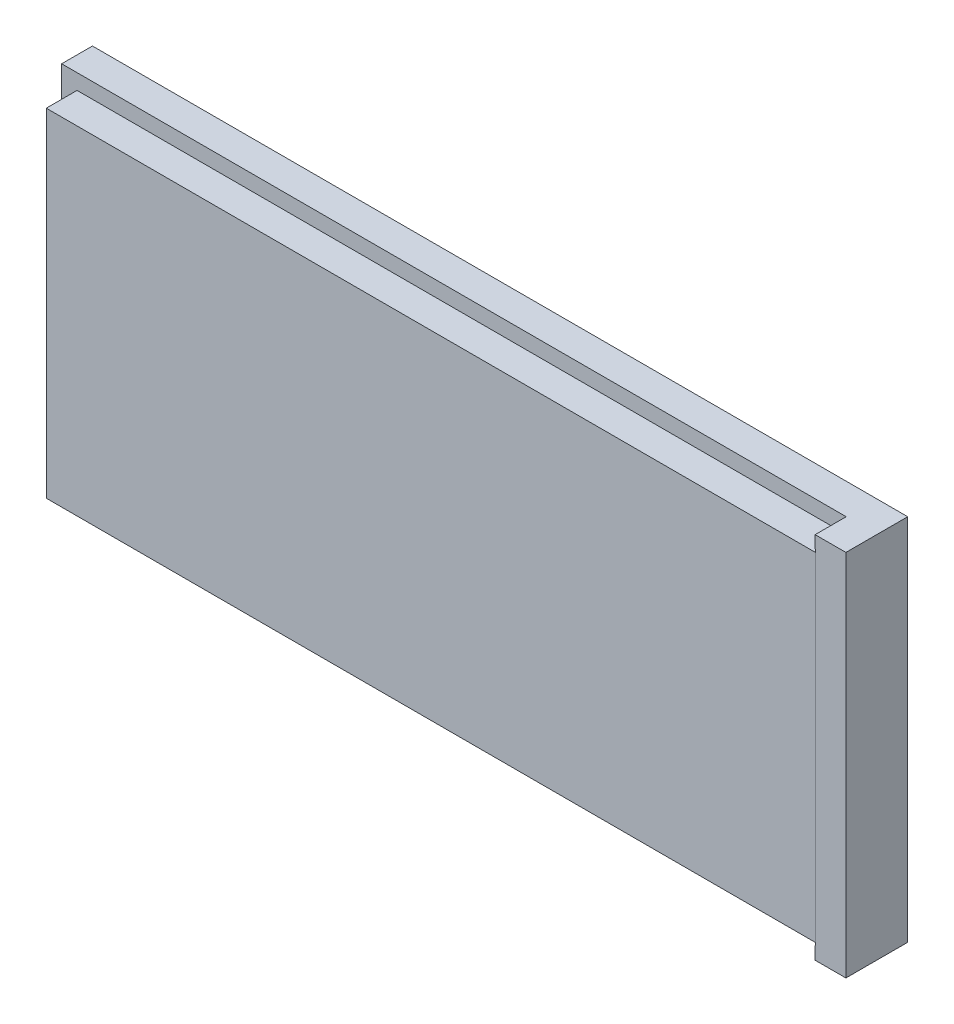
ISO-10303-21;
HEADER;
FILE_DESCRIPTION(('STEP AP214'),'2;1');
FILE_NAME('part.step','',(''),(''),'','','');
FILE_SCHEMA(('AUTOMOTIVE_DESIGN { 1 0 10303 214 1 1 1 1 }'));
ENDSEC;
DATA;
#1=APPLICATION_CONTEXT('core data for automotive mechanical design processes');
#2=APPLICATION_PROTOCOL_DEFINITION('international standard','automotive_design',2000,#1);
#3=PRODUCT_CONTEXT('',#1,'mechanical');
#4=PRODUCT('Part','Part','',(#3));
#5=PRODUCT_RELATED_PRODUCT_CATEGORY('part','',(#4));
#6=PRODUCT_DEFINITION_FORMATION('','',#4);
#7=PRODUCT_DEFINITION_CONTEXT('part definition',#1,'design');
#8=PRODUCT_DEFINITION('design','',#6,#7);
#9=PRODUCT_DEFINITION_SHAPE('','',#8);
#10=(LENGTH_UNIT() NAMED_UNIT(*) SI_UNIT(.MILLI.,.METRE.));
#11=(NAMED_UNIT(*) PLANE_ANGLE_UNIT() SI_UNIT($,.RADIAN.));
#12=(NAMED_UNIT(*) SI_UNIT($,.STERADIAN.) SOLID_ANGLE_UNIT());
#13=UNCERTAINTY_MEASURE_WITH_UNIT(LENGTH_MEASURE(1.E-05),#10,'distance_accuracy_value','');
#14=(GEOMETRIC_REPRESENTATION_CONTEXT(3) GLOBAL_UNCERTAINTY_ASSIGNED_CONTEXT((#13)) GLOBAL_UNIT_ASSIGNED_CONTEXT((#10,
#11,#12)) REPRESENTATION_CONTEXT('',''));
#15=CARTESIAN_POINT('',(0.,0.,0.));
#16=DIRECTION('',(0.,0.,1.));
#17=DIRECTION('',(1.,0.,0.));
#18=AXIS2_PLACEMENT_3D('',#15,#16,#17);
#19=CARTESIAN_POINT('',(-3.4691943127962,-0.0937440758293842,2.));
#20=DIRECTION('',(0.,1.,0.));
#21=DIRECTION('',(0.,0.,1.));
#22=AXIS2_PLACEMENT_3D('',#19,#20,#21);
#23=PLANE('',#22);
#24=DIRECTION('',(1.,0.,0.));
#25=VECTOR('',#24,1.);
#26=CARTESIAN_POINT('',(-3.4691943127962,-0.0937440758293842,1.));
#27=LINE('',#26,#25);
#28=CARTESIAN_POINT('',(-3.4691943127962,-0.0937440758293842,1.));
#29=VERTEX_POINT('',#28);
#30=CARTESIAN_POINT('',(22.0308056872038,-0.0937440758293842,1.));
#31=VERTEX_POINT('',#30);
#32=EDGE_CURVE('E151',#29,#31,#27,.T.);
#33=ORIENTED_EDGE('',*,*,#32,.F.);
#34=DIRECTION('',(0.,0.,-1.));
#35=VECTOR('',#34,1.);
#36=CARTESIAN_POINT('',(-3.4691943127962,-0.0937440758293842,2.));
#37=LINE('',#36,#35);
#38=CARTESIAN_POINT('',(-3.4691943127962,-0.0937440758293842,0.));
#39=VERTEX_POINT('',#38);
#40=EDGE_CURVE('E11',#29,#39,#37,.T.);
#41=ORIENTED_EDGE('',*,*,#40,.T.);
#42=DIRECTION('',(1.,0.,0.));
#43=VECTOR('',#42,1.);
#44=CARTESIAN_POINT('',(-3.4691943127962,-0.0937440758293842,0.));
#45=LINE('',#44,#43);
#46=CARTESIAN_POINT('',(23.0308056872038,-0.0937440758293842,0.));
#47=VERTEX_POINT('',#46);
#48=EDGE_CURVE('E164',#39,#47,#45,.T.);
#49=ORIENTED_EDGE('',*,*,#48,.T.);
#50=DIRECTION('',(0.,0.,-1.));
#51=VECTOR('',#50,1.);
#52=CARTESIAN_POINT('',(23.0308056872038,-0.0937440758293842,0.));
#53=LINE('',#52,#51);
#54=CARTESIAN_POINT('',(23.0308056872038,-0.0937440758293842,2.00959070688684));
#55=VERTEX_POINT('',#54);
#56=EDGE_CURVE('E220',#55,#47,#53,.T.);
#57=ORIENTED_EDGE('',*,*,#56,.F.);
#58=DIRECTION('',(-1.,0.,0.));
#59=VECTOR('',#58,1.);
#60=CARTESIAN_POINT('',(23.0308056872038,-0.0937440758293842,2.00959070688684));
#61=LINE('',#60,#59);
#62=CARTESIAN_POINT('',(22.0308056872038,-0.0937440758293842,2.00959070688684));
#63=VERTEX_POINT('',#62);
#64=EDGE_CURVE('E227',#55,#63,#61,.T.);
#65=ORIENTED_EDGE('',*,*,#64,.T.);
#66=DIRECTION('',(0.,0.,-1.));
#67=VECTOR('',#66,1.);
#68=CARTESIAN_POINT('',(22.0308056872038,-0.0937440758293842,0.));
#69=LINE('',#68,#67);
#70=EDGE_CURVE('E211',#63,#31,#69,.T.);
#71=ORIENTED_EDGE('',*,*,#70,.T.);
#72=EDGE_LOOP('',(#33,#41,#49,#57,#65,#71));
#73=FACE_BOUND('',#72,.T.);
#74=ADVANCED_FACE('F43',(#73),#23,.F.);
#75=CARTESIAN_POINT('',(-3.4691943127962,11.8862559241706,2.));
#76=DIRECTION('',(0.,-1.,0.));
#77=DIRECTION('',(0.,0.,-1.));
#78=AXIS2_PLACEMENT_3D('',#75,#76,#77);
#79=PLANE('',#78);
#80=DIRECTION('',(-1.,0.,0.));
#81=VECTOR('',#80,1.);
#82=CARTESIAN_POINT('',(-3.4691943127962,11.8862559241706,1.));
#83=LINE('',#82,#81);
#84=CARTESIAN_POINT('',(22.0308056872038,11.8862559241706,1.));
#85=VERTEX_POINT('',#84);
#86=CARTESIAN_POINT('',(-3.4691943127962,11.8862559241706,1.));
#87=VERTEX_POINT('',#86);
#88=EDGE_CURVE('E156',#85,#87,#83,.T.);
#89=ORIENTED_EDGE('',*,*,#88,.F.);
#90=DIRECTION('',(0.,0.,1.));
#91=VECTOR('',#90,1.);
#92=CARTESIAN_POINT('',(22.0308056872038,11.8862559241706,0.));
#93=LINE('',#92,#91);
#94=CARTESIAN_POINT('',(22.0308056872038,11.8862559241706,2.00959070688684));
#95=VERTEX_POINT('',#94);
#96=EDGE_CURVE('E282',#85,#95,#93,.T.);
#97=ORIENTED_EDGE('',*,*,#96,.T.);
#98=DIRECTION('',(-1.,0.,0.));
#99=VECTOR('',#98,1.);
#100=CARTESIAN_POINT('',(23.0308056872038,11.8862559241706,2.00959070688684));
#101=LINE('',#100,#99);
#102=CARTESIAN_POINT('',(23.0308056872038,11.8862559241706,2.00959070688684));
#103=VERTEX_POINT('',#102);
#104=EDGE_CURVE('E153',#103,#95,#101,.T.);
#105=ORIENTED_EDGE('',*,*,#104,.F.);
#106=DIRECTION('',(0.,0.,1.));
#107=VECTOR('',#106,1.);
#108=CARTESIAN_POINT('',(23.0308056872038,11.8862559241706,0.));
#109=LINE('',#108,#107);
#110=CARTESIAN_POINT('',(23.0308056872038,11.8862559241706,0.));
#111=VERTEX_POINT('',#110);
#112=EDGE_CURVE('E232',#111,#103,#109,.T.);
#113=ORIENTED_EDGE('',*,*,#112,.F.);
#114=DIRECTION('',(-1.,0.,0.));
#115=VECTOR('',#114,1.);
#116=CARTESIAN_POINT('',(-3.4691943127962,11.8862559241706,0.));
#117=LINE('',#116,#115);
#118=CARTESIAN_POINT('',(-3.4691943127962,11.8862559241706,0.));
#119=VERTEX_POINT('',#118);
#120=EDGE_CURVE('E168',#111,#119,#117,.T.);
#121=ORIENTED_EDGE('',*,*,#120,.T.);
#122=DIRECTION('',(0.,0.,-1.));
#123=VECTOR('',#122,1.);
#124=CARTESIAN_POINT('',(-3.4691943127962,11.8862559241706,2.));
#125=LINE('',#124,#123);
#126=EDGE_CURVE('E54',#87,#119,#125,.T.);
#127=ORIENTED_EDGE('',*,*,#126,.F.);
#128=EDGE_LOOP('',(#89,#97,#105,#113,#121,#127));
#129=FACE_BOUND('',#128,.T.);
#130=ADVANCED_FACE('F198',(#129),#79,.F.);
#131=CARTESIAN_POINT('',(-3.4691943127962,-0.0937440758293842,2.));
#132=DIRECTION('',(1.,0.,0.));
#133=DIRECTION('',(0.,0.,-1.));
#134=AXIS2_PLACEMENT_3D('',#131,#132,#133);
#135=PLANE('',#134);
#136=ORIENTED_EDGE('',*,*,#40,.F.);
#137=DIRECTION('',(0.,-1.,0.));
#138=VECTOR('',#137,1.);
#139=CARTESIAN_POINT('',(-3.4691943127962,11.8862559241706,1.));
#140=LINE('',#139,#138);
#141=EDGE_CURVE('E212',#87,#29,#140,.T.);
#142=ORIENTED_EDGE('',*,*,#141,.F.);
#143=ORIENTED_EDGE('',*,*,#126,.T.);
#144=DIRECTION('',(0.,-1.,0.));
#145=VECTOR('',#144,1.);
#146=CARTESIAN_POINT('',(-3.4691943127962,-0.0937440758293842,0.));
#147=LINE('',#146,#145);
#148=EDGE_CURVE('E161',#119,#39,#147,.T.);
#149=ORIENTED_EDGE('',*,*,#148,.T.);
#150=EDGE_LOOP('',(#136,#142,#143,#149));
#151=FACE_BOUND('',#150,.T.);
#152=ADVANCED_FACE('F45',(#151),#135,.F.);
#153=CARTESIAN_POINT('',(0.,0.,2.));
#154=DIRECTION('',(0.,0.,-1.));
#155=DIRECTION('',(-1.,0.,0.));
#156=AXIS2_PLACEMENT_3D('',#153,#154,#155);
#157=PLANE('',#156);
#158=DIRECTION('',(1.,0.,0.));
#159=VECTOR('',#158,1.);
#160=CARTESIAN_POINT('',(-3.4691943127962,11.3862559241706,2.));
#161=LINE('',#160,#159);
#162=CARTESIAN_POINT('',(-2.9691943127962,11.3862559241706,2.));
#163=VERTEX_POINT('',#162);
#164=CARTESIAN_POINT('',(22.0308056872038,11.3862559241706,2.00479535344342));
#165=VERTEX_POINT('',#164);
#166=EDGE_CURVE('E47',#163,#165,#161,.T.);
#167=ORIENTED_EDGE('',*,*,#166,.F.);
#168=DIRECTION('',(0.,1.,0.));
#169=VECTOR('',#168,1.);
#170=CARTESIAN_POINT('',(-2.9691943127962,0.406255924170616,2.));
#171=LINE('',#170,#169);
#172=CARTESIAN_POINT('',(-2.9691943127962,0.406255924170616,2.));
#173=VERTEX_POINT('',#172);
#174=EDGE_CURVE('E130',#173,#163,#171,.T.);
#175=ORIENTED_EDGE('',*,*,#174,.F.);
#176=DIRECTION('',(-1.,0.,0.));
#177=VECTOR('',#176,1.);
#178=CARTESIAN_POINT('',(-3.4691943127962,0.406255924170616,2.));
#179=LINE('',#178,#177);
#180=CARTESIAN_POINT('',(22.0308056872038,0.406255924170616,2.00479535344342));
#181=VERTEX_POINT('',#180);
#182=EDGE_CURVE('E139',#181,#173,#179,.T.);
#183=ORIENTED_EDGE('',*,*,#182,.F.);
#184=CARTESIAN_POINT('',(22.0308056872038,0.406255924170616,2.));
#185=DIRECTION('',(0.,1.,0.));
#186=VECTOR('',#185,1.);
#187=LINE('',#184,#186);
#188=EDGE_CURVE('E171',#181,#165,#187,.T.);
#189=ORIENTED_EDGE('',*,*,#188,.T.);
#190=EDGE_LOOP('',(#167,#175,#183,#189));
#191=FACE_BOUND('',#190,.T.);
#192=ADVANCED_FACE('F183',(#191),#157,.F.);
#193=CARTESIAN_POINT('',(0.,0.,0.));
#194=DIRECTION('',(0.,0.,-1.));
#195=DIRECTION('',(-1.,0.,0.));
#196=AXIS2_PLACEMENT_3D('',#193,#194,#195);
#197=PLANE('',#196);
#198=ORIENTED_EDGE('',*,*,#148,.F.);
#199=ORIENTED_EDGE('',*,*,#120,.F.);
#200=DIRECTION('',(0.,1.,0.));
#201=VECTOR('',#200,1.);
#202=CARTESIAN_POINT('',(23.0308056872038,-0.0937440758293842,0.));
#203=LINE('',#202,#201);
#204=EDGE_CURVE('E217',#47,#111,#203,.T.);
#205=ORIENTED_EDGE('',*,*,#204,.F.);
#206=ORIENTED_EDGE('',*,*,#48,.F.);
#207=EDGE_LOOP('',(#198,#199,#205,#206));
#208=FACE_BOUND('',#207,.T.);
#209=ADVANCED_FACE('F193',(#208),#197,.T.);
#210=CARTESIAN_POINT('',(-3.4691943127962,0.406255924170616,1.));
#211=DIRECTION('',(0.,1.,0.));
#212=DIRECTION('',(0.,0.,1.));
#213=AXIS2_PLACEMENT_3D('',#210,#211,#212);
#214=PLANE('',#213);
#215=ORIENTED_EDGE('',*,*,#182,.T.);
#216=DIRECTION('',(0.,0.,1.));
#217=VECTOR('',#216,1.);
#218=CARTESIAN_POINT('',(-2.9691943127962,0.406255924170616,1.));
#219=LINE('',#218,#217);
#220=CARTESIAN_POINT('',(-2.9691943127962,0.406255924170616,1.));
#221=VERTEX_POINT('',#220);
#222=EDGE_CURVE('E124',#221,#173,#219,.T.);
#223=ORIENTED_EDGE('',*,*,#222,.F.);
#224=DIRECTION('',(-1.,0.,0.));
#225=VECTOR('',#224,1.);
#226=CARTESIAN_POINT('',(-3.4691943127962,0.406255924170616,1.));
#227=LINE('',#226,#225);
#228=CARTESIAN_POINT('',(22.0308056872038,0.406255924170616,1.));
#229=VERTEX_POINT('',#228);
#230=EDGE_CURVE('E137',#229,#221,#227,.T.);
#231=ORIENTED_EDGE('',*,*,#230,.F.);
#232=DIRECTION('',(0.,0.,1.));
#233=VECTOR('',#232,1.);
#234=CARTESIAN_POINT('',(22.0308056872038,0.406255924170616,1.));
#235=LINE('',#234,#233);
#236=EDGE_CURVE('E147',#229,#181,#235,.T.);
#237=ORIENTED_EDGE('',*,*,#236,.T.);
#238=EDGE_LOOP('',(#215,#223,#231,#237));
#239=FACE_BOUND('',#238,.T.);
#240=ADVANCED_FACE('F135',(#239),#214,.F.);
#241=CARTESIAN_POINT('',(-3.4691943127962,11.3862559241706,1.));
#242=DIRECTION('',(0.,-1.,0.));
#243=DIRECTION('',(0.,0.,-1.));
#244=AXIS2_PLACEMENT_3D('',#241,#242,#243);
#245=PLANE('',#244);
#246=DIRECTION('',(1.,0.,0.));
#247=VECTOR('',#246,1.);
#248=CARTESIAN_POINT('',(-3.4691943127962,11.3862559241706,1.));
#249=LINE('',#248,#247);
#250=CARTESIAN_POINT('',(-2.9691943127962,11.3862559241706,1.));
#251=VERTEX_POINT('',#250);
#252=CARTESIAN_POINT('',(22.0308056872038,11.3862559241706,1.));
#253=VERTEX_POINT('',#252);
#254=EDGE_CURVE('E271',#251,#253,#249,.T.);
#255=ORIENTED_EDGE('',*,*,#254,.F.);
#256=DIRECTION('',(0.,0.,1.));
#257=VECTOR('',#256,1.);
#258=CARTESIAN_POINT('',(-2.9691943127962,11.3862559241706,1.));
#259=LINE('',#258,#257);
#260=EDGE_CURVE('E127',#251,#163,#259,.T.);
#261=ORIENTED_EDGE('',*,*,#260,.T.);
#262=ORIENTED_EDGE('',*,*,#166,.T.);
#263=DIRECTION('',(0.,0.,1.));
#264=VECTOR('',#263,1.);
#265=CARTESIAN_POINT('',(22.0308056872038,11.3862559241706,1.));
#266=LINE('',#265,#264);
#267=EDGE_CURVE('E165',#253,#165,#266,.T.);
#268=ORIENTED_EDGE('',*,*,#267,.F.);
#269=EDGE_LOOP('',(#255,#261,#262,#268));
#270=FACE_BOUND('',#269,.T.);
#271=ADVANCED_FACE('F264',(#270),#245,.F.);
#272=CARTESIAN_POINT('',(0.,0.,1.));
#273=DIRECTION('',(0.,0.,1.));
#274=DIRECTION('',(1.,0.,0.));
#275=AXIS2_PLACEMENT_3D('',#272,#273,#274);
#276=PLANE('',#275);
#277=ORIENTED_EDGE('',*,*,#141,.T.);
#278=ORIENTED_EDGE('',*,*,#32,.T.);
#279=DIRECTION('',(0.,1.,0.));
#280=VECTOR('',#279,1.);
#281=CARTESIAN_POINT('',(22.0308056872038,0.406255924170616,1.));
#282=LINE('',#281,#280);
#283=EDGE_CURVE('E145',#31,#229,#282,.T.);
#284=ORIENTED_EDGE('',*,*,#283,.T.);
#285=ORIENTED_EDGE('',*,*,#230,.T.);
#286=DIRECTION('',(0.,1.,0.));
#287=VECTOR('',#286,1.);
#288=CARTESIAN_POINT('',(-2.9691943127962,0.406255924170616,1.));
#289=LINE('',#288,#287);
#290=EDGE_CURVE('E62',#221,#251,#289,.T.);
#291=ORIENTED_EDGE('',*,*,#290,.T.);
#292=ORIENTED_EDGE('',*,*,#254,.T.);
#293=DIRECTION('',(0.,1.,0.));
#294=VECTOR('',#293,1.);
#295=CARTESIAN_POINT('',(22.0308056872038,11.8862559241706,1.));
#296=LINE('',#295,#294);
#297=EDGE_CURVE('E276',#253,#85,#296,.T.);
#298=ORIENTED_EDGE('',*,*,#297,.T.);
#299=ORIENTED_EDGE('',*,*,#88,.T.);
#300=EDGE_LOOP('',(#277,#278,#284,#285,#291,#292,#298,#299));
#301=FACE_BOUND('',#300,.T.);
#302=ADVANCED_FACE('F143',(#301),#276,.T.);
#303=CARTESIAN_POINT('',(22.0308056872038,0.,0.));
#304=DIRECTION('',(1.,0.,0.));
#305=DIRECTION('',(0.,0.,-1.));
#306=AXIS2_PLACEMENT_3D('',#303,#304,#305);
#307=PLANE('',#306);
#308=ORIENTED_EDGE('',*,*,#297,.F.);
#309=ORIENTED_EDGE('',*,*,#267,.T.);
#310=CARTESIAN_POINT('',(22.0308056872038,11.8862559241706,2.00959070688684));
#311=DIRECTION('',(0.,-1.,0.));
#312=VECTOR('',#311,1.);
#313=LINE('',#310,#312);
#314=EDGE_CURVE('E241',#95,#165,#313,.T.);
#315=ORIENTED_EDGE('',*,*,#314,.F.);
#316=ORIENTED_EDGE('',*,*,#96,.F.);
#317=EDGE_LOOP('',(#308,#309,#315,#316));
#318=FACE_BOUND('',#317,.T.);
#319=ADVANCED_FACE('F259',(#318),#307,.F.);
#320=CARTESIAN_POINT('',(23.0308056872038,-0.0937440758293842,2.00959070688684));
#321=DIRECTION('',(0.,0.,-1.));
#322=DIRECTION('',(-1.,0.,0.));
#323=AXIS2_PLACEMENT_3D('',#320,#321,#322);
#324=PLANE('',#323);
#325=ORIENTED_EDGE('',*,*,#314,.T.);
#326=ORIENTED_EDGE('',*,*,#188,.F.);
#327=CARTESIAN_POINT('',(22.0308056872038,0.406255924170616,2.00959070688684));
#328=DIRECTION('',(0.,-1.,0.));
#329=VECTOR('',#328,1.);
#330=LINE('',#327,#329);
#331=EDGE_CURVE('E286',#181,#63,#330,.T.);
#332=ORIENTED_EDGE('',*,*,#331,.T.);
#333=ORIENTED_EDGE('',*,*,#64,.F.);
#334=DIRECTION('',(0.,-1.,0.));
#335=VECTOR('',#334,1.);
#336=CARTESIAN_POINT('',(23.0308056872038,-0.0937440758293842,2.00959070688684));
#337=LINE('',#336,#335);
#338=EDGE_CURVE('E224',#103,#55,#337,.T.);
#339=ORIENTED_EDGE('',*,*,#338,.F.);
#340=ORIENTED_EDGE('',*,*,#104,.T.);
#341=EDGE_LOOP('',(#325,#326,#332,#333,#339,#340));
#342=FACE_BOUND('',#341,.T.);
#343=ADVANCED_FACE('F249',(#342),#324,.F.);
#344=CARTESIAN_POINT('',(23.0308056872038,0.,0.));
#345=DIRECTION('',(1.,0.,0.));
#346=DIRECTION('',(0.,0.,-1.));
#347=AXIS2_PLACEMENT_3D('',#344,#345,#346);
#348=PLANE('',#347);
#349=ORIENTED_EDGE('',*,*,#204,.T.);
#350=ORIENTED_EDGE('',*,*,#112,.T.);
#351=ORIENTED_EDGE('',*,*,#338,.T.);
#352=ORIENTED_EDGE('',*,*,#56,.T.);
#353=EDGE_LOOP('',(#349,#350,#351,#352));
#354=FACE_BOUND('',#353,.T.);
#355=ADVANCED_FACE('F222',(#354),#348,.T.);
#356=ORIENTED_EDGE('',*,*,#236,.F.);
#357=ORIENTED_EDGE('',*,*,#283,.F.);
#358=ORIENTED_EDGE('',*,*,#70,.F.);
#359=ORIENTED_EDGE('',*,*,#331,.F.);
#360=EDGE_LOOP('',(#356,#357,#358,#359));
#361=FACE_BOUND('',#360,.T.);
#362=ADVANCED_FACE('F260',(#361),#307,.F.);
#363=CARTESIAN_POINT('',(-2.9691943127962,0.406255924170616,1.));
#364=DIRECTION('',(1.,0.,0.));
#365=DIRECTION('',(0.,0.,-1.));
#366=AXIS2_PLACEMENT_3D('',#363,#364,#365);
#367=PLANE('',#366);
#368=ORIENTED_EDGE('',*,*,#174,.T.);
#369=ORIENTED_EDGE('',*,*,#260,.F.);
#370=ORIENTED_EDGE('',*,*,#290,.F.);
#371=ORIENTED_EDGE('',*,*,#222,.T.);
#372=EDGE_LOOP('',(#368,#369,#370,#371));
#373=FACE_BOUND('',#372,.T.);
#374=ADVANCED_FACE('F123',(#373),#367,.F.);
#375=CLOSED_SHELL('',(#74,#130,#152,#192,#209,#240,#271,#302,#319,#343,#355,#362,#374));
#376=MANIFOLD_SOLID_BREP('B2',#375);
#377=ADVANCED_BREP_SHAPE_REPRESENTATION('',(#18,#376),#14);
#378=SHAPE_DEFINITION_REPRESENTATION(#9,#377);
ENDSEC;
END-ISO-10303-21;
